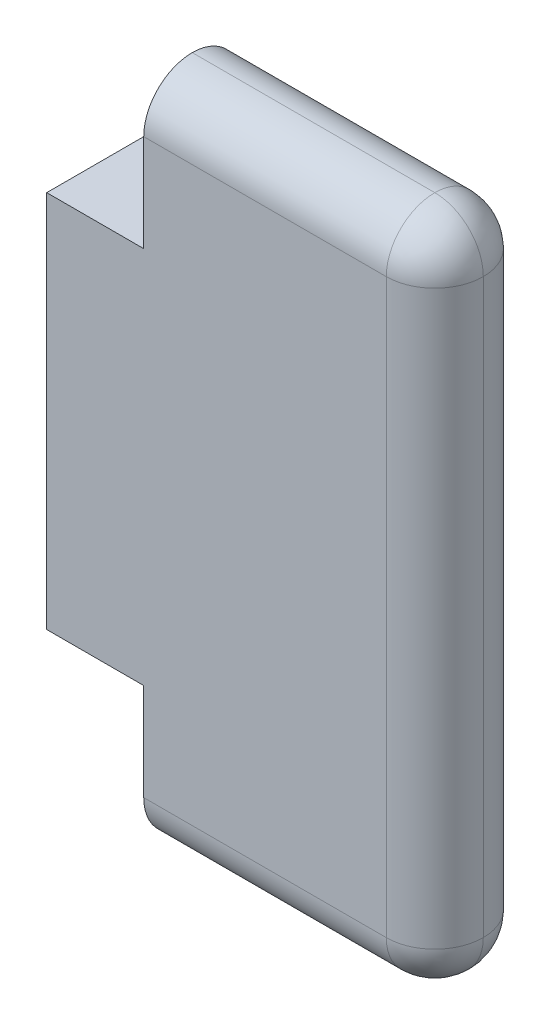
ISO-10303-21;
HEADER;
FILE_DESCRIPTION(('STEP AP214'),'2;1');
FILE_NAME('part.step','',(''),(''),'','','');
FILE_SCHEMA(('AUTOMOTIVE_DESIGN { 1 0 10303 214 1 1 1 1 }'));
ENDSEC;
DATA;
#1=APPLICATION_CONTEXT('core data for automotive mechanical design processes');
#2=APPLICATION_PROTOCOL_DEFINITION('international standard','automotive_design',2000,#1);
#3=PRODUCT_CONTEXT('',#1,'mechanical');
#4=PRODUCT('Part','Part','',(#3));
#5=PRODUCT_RELATED_PRODUCT_CATEGORY('part','',(#4));
#6=PRODUCT_DEFINITION_FORMATION('','',#4);
#7=PRODUCT_DEFINITION_CONTEXT('part definition',#1,'design');
#8=PRODUCT_DEFINITION('design','',#6,#7);
#9=PRODUCT_DEFINITION_SHAPE('','',#8);
#10=(LENGTH_UNIT() NAMED_UNIT(*) SI_UNIT(.MILLI.,.METRE.));
#11=(NAMED_UNIT(*) PLANE_ANGLE_UNIT() SI_UNIT($,.RADIAN.));
#12=(NAMED_UNIT(*) SI_UNIT($,.STERADIAN.) SOLID_ANGLE_UNIT());
#13=UNCERTAINTY_MEASURE_WITH_UNIT(LENGTH_MEASURE(1.E-05),#10,'distance_accuracy_value','');
#14=(GEOMETRIC_REPRESENTATION_CONTEXT(3) GLOBAL_UNCERTAINTY_ASSIGNED_CONTEXT((#13)) GLOBAL_UNIT_ASSIGNED_CONTEXT((#10,
#11,#12)) REPRESENTATION_CONTEXT('',''));
#15=CARTESIAN_POINT('',(0.,0.,0.));
#16=DIRECTION('',(0.,0.,1.));
#17=DIRECTION('',(1.,0.,0.));
#18=AXIS2_PLACEMENT_3D('',#15,#16,#17);
#19=CARTESIAN_POINT('',(9.99999999999998,-19.5,10.));
#20=DIRECTION('',(0.,1.,0.));
#21=DIRECTION('',(0.,0.,1.));
#22=AXIS2_PLACEMENT_3D('',#19,#20,#21);
#23=PLANE('',#22);
#24=DIRECTION('',(1.,0.,0.));
#25=VECTOR('',#24,1.);
#26=CARTESIAN_POINT('',(9.99999999999998,-19.5,0.));
#27=LINE('',#26,#25);
#28=CARTESIAN_POINT('',(0.,-19.5,0.));
#29=VERTEX_POINT('',#28);
#30=CARTESIAN_POINT('',(9.99999999999998,-19.5,0.));
#31=VERTEX_POINT('',#30);
#32=EDGE_CURVE('E139',#29,#31,#27,.T.);
#33=ORIENTED_EDGE('',*,*,#32,.T.);
#34=DIRECTION('',(0.,0.,-1.));
#35=VECTOR('',#34,1.);
#36=CARTESIAN_POINT('',(9.99999999999998,-19.5,10.));
#37=LINE('',#36,#35);
#38=CARTESIAN_POINT('',(9.99999999999998,-19.5,10.));
#39=VERTEX_POINT('',#38);
#40=EDGE_CURVE('E145',#39,#31,#37,.T.);
#41=ORIENTED_EDGE('',*,*,#40,.F.);
#42=DIRECTION('',(1.,0.,0.));
#43=VECTOR('',#42,1.);
#44=CARTESIAN_POINT('',(9.99999999999998,-19.5,10.));
#45=LINE('',#44,#43);
#46=CARTESIAN_POINT('',(0.,-19.5,10.));
#47=VERTEX_POINT('',#46);
#48=EDGE_CURVE('E161',#47,#39,#45,.T.);
#49=ORIENTED_EDGE('',*,*,#48,.F.);
#50=DIRECTION('',(0.,0.,-1.));
#51=VECTOR('',#50,1.);
#52=CARTESIAN_POINT('',(0.,-19.5,10.));
#53=LINE('',#52,#51);
#54=EDGE_CURVE('E154',#47,#29,#53,.T.);
#55=ORIENTED_EDGE('',*,*,#54,.T.);
#56=EDGE_LOOP('',(#33,#41,#49,#55));
#57=FACE_BOUND('',#56,.T.);
#58=ADVANCED_FACE('F35',(#57),#23,.F.);
#59=CARTESIAN_POINT('',(9.99999999999998,-34.5,10.));
#60=DIRECTION('',(1.,0.,0.));
#61=DIRECTION('',(0.,0.,-1.));
#62=AXIS2_PLACEMENT_3D('',#59,#60,#61);
#63=PLANE('',#62);
#64=DIRECTION('',(0.,-1.,0.));
#65=VECTOR('',#64,1.);
#66=CARTESIAN_POINT('',(9.99999999999998,-34.5,0.));
#67=LINE('',#66,#65);
#68=CARTESIAN_POINT('',(9.99999999999998,-29.5,0.));
#69=VERTEX_POINT('',#68);
#70=EDGE_CURVE('E168',#31,#69,#67,.T.);
#71=ORIENTED_EDGE('',*,*,#70,.T.);
#72=CARTESIAN_POINT('',(9.99999999999998,-29.5,5.));
#73=DIRECTION('',(1.,0.,0.));
#74=DIRECTION('',(0.,0.,-1.));
#75=AXIS2_PLACEMENT_3D('',#72,#73,#74);
#76=CIRCLE('',#75,5.);
#77=CARTESIAN_POINT('',(9.99999999999998,-34.5,5.));
#78=VERTEX_POINT('',#77);
#79=EDGE_CURVE('E11',#69,#78,#76,.F.);
#80=ORIENTED_EDGE('',*,*,#79,.T.);
#81=CARTESIAN_POINT('',(9.99999999999998,-29.5,5.));
#82=DIRECTION('',(1.,0.,0.));
#83=DIRECTION('',(0.,0.,-1.));
#84=AXIS2_PLACEMENT_3D('',#81,#82,#83);
#85=CIRCLE('',#84,5.);
#86=CARTESIAN_POINT('',(9.99999999999998,-29.5,10.));
#87=VERTEX_POINT('',#86);
#88=EDGE_CURVE('E45',#78,#87,#85,.F.);
#89=ORIENTED_EDGE('',*,*,#88,.T.);
#90=DIRECTION('',(0.,-1.,0.));
#91=VECTOR('',#90,1.);
#92=CARTESIAN_POINT('',(9.99999999999998,-34.5,10.));
#93=LINE('',#92,#91);
#94=EDGE_CURVE('E180',#39,#87,#93,.T.);
#95=ORIENTED_EDGE('',*,*,#94,.F.);
#96=ORIENTED_EDGE('',*,*,#40,.T.);
#97=EDGE_LOOP('',(#71,#80,#89,#95,#96));
#98=FACE_BOUND('',#97,.T.);
#99=ADVANCED_FACE('F199',(#98),#63,.F.);
#100=CARTESIAN_POINT('',(9.99999999999998,19.5,10.));
#101=DIRECTION('',(1.,0.,0.));
#102=DIRECTION('',(0.,1.,0.));
#103=AXIS2_PLACEMENT_3D('',#100,#101,#102);
#104=PLANE('',#103);
#105=CARTESIAN_POINT('',(9.99999999999997,29.5,5.));
#106=DIRECTION('',(1.,0.,0.));
#107=DIRECTION('',(0.,1.,0.));
#108=AXIS2_PLACEMENT_3D('',#105,#106,#107);
#109=CIRCLE('',#108,5.);
#110=CARTESIAN_POINT('',(9.99999999999997,29.5,10.));
#111=VERTEX_POINT('',#110);
#112=CARTESIAN_POINT('',(9.99999999999997,34.5,5.));
#113=VERTEX_POINT('',#112);
#114=EDGE_CURVE('E125',#111,#113,#109,.F.);
#115=ORIENTED_EDGE('',*,*,#114,.T.);
#116=CARTESIAN_POINT('',(9.99999999999997,29.5,5.));
#117=DIRECTION('',(1.,0.,0.));
#118=DIRECTION('',(0.,1.,0.));
#119=AXIS2_PLACEMENT_3D('',#116,#117,#118);
#120=CIRCLE('',#119,5.);
#121=CARTESIAN_POINT('',(9.99999999999997,29.5,0.));
#122=VERTEX_POINT('',#121);
#123=EDGE_CURVE('E122',#113,#122,#120,.F.);
#124=ORIENTED_EDGE('',*,*,#123,.T.);
#125=DIRECTION('',(0.,-1.,0.));
#126=VECTOR('',#125,1.);
#127=CARTESIAN_POINT('',(9.99999999999998,19.5,0.));
#128=LINE('',#127,#126);
#129=CARTESIAN_POINT('',(9.99999999999998,19.5,0.));
#130=VERTEX_POINT('',#129);
#131=EDGE_CURVE('E165',#122,#130,#128,.T.);
#132=ORIENTED_EDGE('',*,*,#131,.T.);
#133=DIRECTION('',(0.,0.,-1.));
#134=VECTOR('',#133,1.);
#135=CARTESIAN_POINT('',(9.99999999999998,19.5,10.));
#136=LINE('',#135,#134);
#137=CARTESIAN_POINT('',(9.99999999999998,19.5,10.));
#138=VERTEX_POINT('',#137);
#139=EDGE_CURVE('E148',#138,#130,#136,.T.);
#140=ORIENTED_EDGE('',*,*,#139,.F.);
#141=DIRECTION('',(0.,-1.,0.));
#142=VECTOR('',#141,1.);
#143=CARTESIAN_POINT('',(9.99999999999998,19.5,10.));
#144=LINE('',#143,#142);
#145=EDGE_CURVE('E177',#111,#138,#144,.T.);
#146=ORIENTED_EDGE('',*,*,#145,.F.);
#147=EDGE_LOOP('',(#115,#124,#132,#140,#146));
#148=FACE_BOUND('',#147,.T.);
#149=ADVANCED_FACE('F248',(#148),#104,.F.);
#150=CARTESIAN_POINT('',(0.,19.5,10.));
#151=DIRECTION('',(0.,-1.,0.));
#152=DIRECTION('',(0.,0.,-1.));
#153=AXIS2_PLACEMENT_3D('',#150,#151,#152);
#154=PLANE('',#153);
#155=DIRECTION('',(-1.,0.,0.));
#156=VECTOR('',#155,1.);
#157=CARTESIAN_POINT('',(0.,19.5,0.));
#158=LINE('',#157,#156);
#159=CARTESIAN_POINT('',(0.,19.5,0.));
#160=VERTEX_POINT('',#159);
#161=EDGE_CURVE('E162',#130,#160,#158,.T.);
#162=ORIENTED_EDGE('',*,*,#161,.T.);
#163=DIRECTION('',(0.,0.,-1.));
#164=VECTOR('',#163,1.);
#165=CARTESIAN_POINT('',(0.,19.5,10.));
#166=LINE('',#165,#164);
#167=CARTESIAN_POINT('',(0.,19.5,10.));
#168=VERTEX_POINT('',#167);
#169=EDGE_CURVE('E151',#168,#160,#166,.T.);
#170=ORIENTED_EDGE('',*,*,#169,.F.);
#171=DIRECTION('',(-1.,0.,0.));
#172=VECTOR('',#171,1.);
#173=CARTESIAN_POINT('',(0.,19.5,10.));
#174=LINE('',#173,#172);
#175=EDGE_CURVE('E174',#138,#168,#174,.T.);
#176=ORIENTED_EDGE('',*,*,#175,.F.);
#177=ORIENTED_EDGE('',*,*,#139,.T.);
#178=EDGE_LOOP('',(#162,#170,#176,#177));
#179=FACE_BOUND('',#178,.T.);
#180=ADVANCED_FACE('F255',(#179),#154,.F.);
#181=CARTESIAN_POINT('',(0.,-19.5,10.));
#182=DIRECTION('',(1.,0.,0.));
#183=DIRECTION('',(0.,1.,0.));
#184=AXIS2_PLACEMENT_3D('',#181,#182,#183);
#185=PLANE('',#184);
#186=DIRECTION('',(0.,-1.,0.));
#187=VECTOR('',#186,1.);
#188=CARTESIAN_POINT('',(0.,-19.5,0.));
#189=LINE('',#188,#187);
#190=EDGE_CURVE('E158',#160,#29,#189,.T.);
#191=ORIENTED_EDGE('',*,*,#190,.T.);
#192=ORIENTED_EDGE('',*,*,#54,.F.);
#193=DIRECTION('',(0.,-1.,0.));
#194=VECTOR('',#193,1.);
#195=CARTESIAN_POINT('',(0.,-19.5,10.));
#196=LINE('',#195,#194);
#197=EDGE_CURVE('E157',#168,#47,#196,.T.);
#198=ORIENTED_EDGE('',*,*,#197,.F.);
#199=ORIENTED_EDGE('',*,*,#169,.T.);
#200=EDGE_LOOP('',(#191,#192,#198,#199));
#201=FACE_BOUND('',#200,.T.);
#202=ADVANCED_FACE('F259',(#201),#185,.F.);
#203=CARTESIAN_POINT('',(0.,0.,10.));
#204=DIRECTION('',(0.,0.,-1.));
#205=DIRECTION('',(-1.,0.,0.));
#206=AXIS2_PLACEMENT_3D('',#203,#204,#205);
#207=PLANE('',#206);
#208=DIRECTION('',(0.,1.,0.));
#209=VECTOR('',#208,1.);
#210=CARTESIAN_POINT('',(35.,0.,10.));
#211=LINE('',#210,#209);
#212=CARTESIAN_POINT('',(35.,-29.5,10.));
#213=VERTEX_POINT('',#212);
#214=CARTESIAN_POINT('',(35.,29.5,10.));
#215=VERTEX_POINT('',#214);
#216=EDGE_CURVE('E142',#213,#215,#211,.T.);
#217=ORIENTED_EDGE('',*,*,#216,.T.);
#218=DIRECTION('',(-1.,0.,0.));
#219=VECTOR('',#218,1.);
#220=CARTESIAN_POINT('',(0.,29.5,10.));
#221=LINE('',#220,#219);
#222=EDGE_CURVE('E112',#215,#111,#221,.T.);
#223=ORIENTED_EDGE('',*,*,#222,.T.);
#224=ORIENTED_EDGE('',*,*,#145,.T.);
#225=ORIENTED_EDGE('',*,*,#175,.T.);
#226=ORIENTED_EDGE('',*,*,#197,.T.);
#227=ORIENTED_EDGE('',*,*,#48,.T.);
#228=ORIENTED_EDGE('',*,*,#94,.T.);
#229=DIRECTION('',(1.,0.,0.));
#230=VECTOR('',#229,1.);
#231=CARTESIAN_POINT('',(0.,-29.5,10.));
#232=LINE('',#231,#230);
#233=EDGE_CURVE('E115',#87,#213,#232,.T.);
#234=ORIENTED_EDGE('',*,*,#233,.T.);
#235=EDGE_LOOP('',(#217,#223,#224,#225,#226,#227,#228,#234));
#236=FACE_BOUND('',#235,.T.);
#237=ADVANCED_FACE('F188',(#236),#207,.F.);
#238=CARTESIAN_POINT('',(0.,0.,0.));
#239=DIRECTION('',(0.,0.,-1.));
#240=DIRECTION('',(-1.,0.,0.));
#241=AXIS2_PLACEMENT_3D('',#238,#239,#240);
#242=PLANE('',#241);
#243=ORIENTED_EDGE('',*,*,#131,.F.);
#244=DIRECTION('',(-1.,0.,0.));
#245=VECTOR('',#244,1.);
#246=CARTESIAN_POINT('',(35.,29.5,0.));
#247=LINE('',#246,#245);
#248=CARTESIAN_POINT('',(35.,29.5,0.));
#249=VERTEX_POINT('',#248);
#250=EDGE_CURVE('E118',#122,#249,#247,.F.);
#251=ORIENTED_EDGE('',*,*,#250,.T.);
#252=DIRECTION('',(0.,1.,0.));
#253=VECTOR('',#252,1.);
#254=CARTESIAN_POINT('',(35.,-34.5,0.));
#255=LINE('',#254,#253);
#256=CARTESIAN_POINT('',(35.,-29.5,0.));
#257=VERTEX_POINT('',#256);
#258=EDGE_CURVE('E136',#249,#257,#255,.F.);
#259=ORIENTED_EDGE('',*,*,#258,.T.);
#260=DIRECTION('',(1.,0.,0.));
#261=VECTOR('',#260,1.);
#262=CARTESIAN_POINT('',(9.99999999999998,-29.5,0.));
#263=LINE('',#262,#261);
#264=EDGE_CURVE('E93',#257,#69,#263,.F.);
#265=ORIENTED_EDGE('',*,*,#264,.T.);
#266=ORIENTED_EDGE('',*,*,#70,.F.);
#267=ORIENTED_EDGE('',*,*,#32,.F.);
#268=ORIENTED_EDGE('',*,*,#190,.F.);
#269=ORIENTED_EDGE('',*,*,#161,.F.);
#270=EDGE_LOOP('',(#243,#251,#259,#265,#266,#267,#268,#269));
#271=FACE_BOUND('',#270,.T.);
#272=ADVANCED_FACE('F224',(#271),#242,.T.);
#273=CARTESIAN_POINT('',(35.,0.,5.));
#274=DIRECTION('',(0.,1.,0.));
#275=DIRECTION('',(0.,0.,1.));
#276=AXIS2_PLACEMENT_3D('',#273,#274,#275);
#277=CYLINDRICAL_SURFACE('',#276,5.);
#278=DIRECTION('',(0.,1.,0.));
#279=VECTOR('',#278,1.);
#280=CARTESIAN_POINT('',(40.,34.5,5.));
#281=LINE('',#280,#279);
#282=CARTESIAN_POINT('',(40.,29.5,5.));
#283=VERTEX_POINT('',#282);
#284=CARTESIAN_POINT('',(40.,-29.5,5.));
#285=VERTEX_POINT('',#284);
#286=EDGE_CURVE('E103',#283,#285,#281,.F.);
#287=ORIENTED_EDGE('',*,*,#286,.F.);
#288=CARTESIAN_POINT('',(35.,29.5,5.));
#289=DIRECTION('',(0.,1.,0.));
#290=DIRECTION('',(0.,0.,1.));
#291=AXIS2_PLACEMENT_3D('',#288,#289,#290);
#292=CIRCLE('',#291,5.);
#293=EDGE_CURVE('E128',#283,#215,#292,.F.);
#294=ORIENTED_EDGE('',*,*,#293,.T.);
#295=ORIENTED_EDGE('',*,*,#216,.F.);
#296=CARTESIAN_POINT('',(35.,-29.5,5.));
#297=DIRECTION('',(0.,1.,0.));
#298=DIRECTION('',(0.,0.,1.));
#299=AXIS2_PLACEMENT_3D('',#296,#297,#298);
#300=CIRCLE('',#299,5.);
#301=EDGE_CURVE('E86',#213,#285,#300,.T.);
#302=ORIENTED_EDGE('',*,*,#301,.T.);
#303=EDGE_LOOP('',(#287,#294,#295,#302));
#304=FACE_BOUND('',#303,.T.);
#305=ADVANCED_FACE('F243',(#304),#277,.T.);
#306=CARTESIAN_POINT('',(35.,34.5,5.));
#307=DIRECTION('',(0.,-1.,0.));
#308=DIRECTION('',(0.,0.,-1.));
#309=AXIS2_PLACEMENT_3D('',#306,#307,#308);
#310=CYLINDRICAL_SURFACE('',#309,5.);
#311=ORIENTED_EDGE('',*,*,#258,.F.);
#312=CARTESIAN_POINT('',(35.,29.5,5.));
#313=DIRECTION('',(0.,-1.,0.));
#314=DIRECTION('',(0.,0.,-1.));
#315=AXIS2_PLACEMENT_3D('',#312,#313,#314);
#316=CIRCLE('',#315,5.);
#317=EDGE_CURVE('E132',#249,#283,#316,.T.);
#318=ORIENTED_EDGE('',*,*,#317,.T.);
#319=ORIENTED_EDGE('',*,*,#286,.T.);
#320=CARTESIAN_POINT('',(35.,-29.5,5.));
#321=DIRECTION('',(0.,-1.,0.));
#322=DIRECTION('',(0.,0.,-1.));
#323=AXIS2_PLACEMENT_3D('',#320,#321,#322);
#324=CIRCLE('',#323,5.);
#325=EDGE_CURVE('E99',#285,#257,#324,.F.);
#326=ORIENTED_EDGE('',*,*,#325,.T.);
#327=EDGE_LOOP('',(#311,#318,#319,#326));
#328=FACE_BOUND('',#327,.T.);
#329=ADVANCED_FACE('F229',(#328),#310,.T.);
#330=CARTESIAN_POINT('',(0.,29.5,5.));
#331=DIRECTION('',(-1.,0.,0.));
#332=DIRECTION('',(0.,0.,1.));
#333=AXIS2_PLACEMENT_3D('',#330,#331,#332);
#334=CYLINDRICAL_SURFACE('',#333,5.);
#335=ORIENTED_EDGE('',*,*,#114,.F.);
#336=ORIENTED_EDGE('',*,*,#222,.F.);
#337=CARTESIAN_POINT('',(35.,29.5,5.));
#338=DIRECTION('',(1.,0.,0.));
#339=DIRECTION('',(0.,0.,-1.));
#340=AXIS2_PLACEMENT_3D('',#337,#338,#339);
#341=CIRCLE('',#340,5.);
#342=CARTESIAN_POINT('',(35.,34.5,5.));
#343=VERTEX_POINT('',#342);
#344=EDGE_CURVE('E64',#343,#215,#341,.T.);
#345=ORIENTED_EDGE('',*,*,#344,.F.);
#346=DIRECTION('',(-1.,0.,0.));
#347=VECTOR('',#346,1.);
#348=CARTESIAN_POINT('',(9.99999999999997,34.5,5.));
#349=LINE('',#348,#347);
#350=EDGE_CURVE('E104',#113,#343,#349,.F.);
#351=ORIENTED_EDGE('',*,*,#350,.F.);
#352=EDGE_LOOP('',(#335,#336,#345,#351));
#353=FACE_BOUND('',#352,.T.);
#354=ADVANCED_FACE('F246',(#353),#334,.T.);
#355=CARTESIAN_POINT('',(35.,29.5,5.));
#356=DIRECTION('',(0.,0.,1.));
#357=DIRECTION('',(1.,0.,0.));
#358=AXIS2_PLACEMENT_3D('',#355,#356,#357);
#359=SPHERICAL_SURFACE('',#358,5.);
#360=ORIENTED_EDGE('',*,*,#344,.T.);
#361=ORIENTED_EDGE('',*,*,#293,.F.);
#362=CARTESIAN_POINT('',(35.,29.5,5.));
#363=DIRECTION('',(0.,0.,-1.));
#364=DIRECTION('',(-1.,0.,0.));
#365=AXIS2_PLACEMENT_3D('',#362,#363,#364);
#366=CIRCLE('',#365,5.);
#367=EDGE_CURVE('E106',#343,#283,#366,.T.);
#368=ORIENTED_EDGE('',*,*,#367,.F.);
#369=EDGE_LOOP('',(#360,#361,#368));
#370=FACE_BOUND('',#369,.T.);
#371=ADVANCED_FACE('F240',(#370),#359,.T.);
#372=CARTESIAN_POINT('',(9.99999999999997,29.5,5.));
#373=DIRECTION('',(1.,0.,0.));
#374=DIRECTION('',(0.,0.,-1.));
#375=AXIS2_PLACEMENT_3D('',#372,#373,#374);
#376=CYLINDRICAL_SURFACE('',#375,5.);
#377=ORIENTED_EDGE('',*,*,#123,.F.);
#378=ORIENTED_EDGE('',*,*,#350,.T.);
#379=CARTESIAN_POINT('',(35.,29.5,5.));
#380=DIRECTION('',(1.,0.,0.));
#381=DIRECTION('',(0.,0.,-1.));
#382=AXIS2_PLACEMENT_3D('',#379,#380,#381);
#383=CIRCLE('',#382,5.);
#384=EDGE_CURVE('E80',#249,#343,#383,.T.);
#385=ORIENTED_EDGE('',*,*,#384,.F.);
#386=ORIENTED_EDGE('',*,*,#250,.F.);
#387=EDGE_LOOP('',(#377,#378,#385,#386));
#388=FACE_BOUND('',#387,.T.);
#389=ADVANCED_FACE('F234',(#388),#376,.T.);
#390=CARTESIAN_POINT('',(35.,29.5,5.));
#391=DIRECTION('',(0.,0.,1.));
#392=DIRECTION('',(1.,0.,0.));
#393=AXIS2_PLACEMENT_3D('',#390,#391,#392);
#394=SPHERICAL_SURFACE('',#393,5.);
#395=ORIENTED_EDGE('',*,*,#384,.T.);
#396=ORIENTED_EDGE('',*,*,#367,.T.);
#397=ORIENTED_EDGE('',*,*,#317,.F.);
#398=EDGE_LOOP('',(#395,#396,#397));
#399=FACE_BOUND('',#398,.T.);
#400=ADVANCED_FACE('F237',(#399),#394,.T.);
#401=CARTESIAN_POINT('',(0.,-29.5,5.));
#402=DIRECTION('',(1.,0.,0.));
#403=DIRECTION('',(0.,1.,0.));
#404=AXIS2_PLACEMENT_3D('',#401,#402,#403);
#405=CYLINDRICAL_SURFACE('',#404,5.);
#406=ORIENTED_EDGE('',*,*,#233,.F.);
#407=ORIENTED_EDGE('',*,*,#88,.F.);
#408=DIRECTION('',(1.,0.,0.));
#409=VECTOR('',#408,1.);
#410=CARTESIAN_POINT('',(40.,-34.5,5.));
#411=LINE('',#410,#409);
#412=CARTESIAN_POINT('',(35.,-34.5,5.));
#413=VERTEX_POINT('',#412);
#414=EDGE_CURVE('E39',#413,#78,#411,.F.);
#415=ORIENTED_EDGE('',*,*,#414,.F.);
#416=CARTESIAN_POINT('',(35.,-29.5,5.));
#417=DIRECTION('',(1.,0.,0.));
#418=DIRECTION('',(0.,1.,0.));
#419=AXIS2_PLACEMENT_3D('',#416,#417,#418);
#420=CIRCLE('',#419,5.);
#421=EDGE_CURVE('E76',#213,#413,#420,.T.);
#422=ORIENTED_EDGE('',*,*,#421,.F.);
#423=EDGE_LOOP('',(#406,#407,#415,#422));
#424=FACE_BOUND('',#423,.T.);
#425=ADVANCED_FACE('F37',(#424),#405,.T.);
#426=CARTESIAN_POINT('',(40.,-29.5,5.));
#427=DIRECTION('',(-1.,0.,0.));
#428=DIRECTION('',(0.,-1.,0.));
#429=AXIS2_PLACEMENT_3D('',#426,#427,#428);
#430=CYLINDRICAL_SURFACE('',#429,5.);
#431=ORIENTED_EDGE('',*,*,#79,.F.);
#432=ORIENTED_EDGE('',*,*,#264,.F.);
#433=CARTESIAN_POINT('',(35.,-29.5,5.));
#434=DIRECTION('',(1.,0.,0.));
#435=DIRECTION('',(0.,1.,0.));
#436=AXIS2_PLACEMENT_3D('',#433,#434,#435);
#437=CIRCLE('',#436,5.);
#438=EDGE_CURVE('E87',#413,#257,#437,.T.);
#439=ORIENTED_EDGE('',*,*,#438,.F.);
#440=ORIENTED_EDGE('',*,*,#414,.T.);
#441=EDGE_LOOP('',(#431,#432,#439,#440));
#442=FACE_BOUND('',#441,.T.);
#443=ADVANCED_FACE('F90',(#442),#430,.T.);
#444=CARTESIAN_POINT('',(35.,-29.5,5.));
#445=DIRECTION('',(0.,0.,1.));
#446=DIRECTION('',(1.,0.,0.));
#447=AXIS2_PLACEMENT_3D('',#444,#445,#446);
#448=SPHERICAL_SURFACE('',#447,5.);
#449=ORIENTED_EDGE('',*,*,#301,.F.);
#450=ORIENTED_EDGE('',*,*,#421,.T.);
#451=CARTESIAN_POINT('',(35.,-29.5,5.));
#452=DIRECTION('',(0.,0.,-1.));
#453=DIRECTION('',(-1.,0.,0.));
#454=AXIS2_PLACEMENT_3D('',#451,#452,#453);
#455=CIRCLE('',#454,5.);
#456=EDGE_CURVE('E85',#285,#413,#455,.T.);
#457=ORIENTED_EDGE('',*,*,#456,.F.);
#458=EDGE_LOOP('',(#449,#450,#457));
#459=FACE_BOUND('',#458,.T.);
#460=ADVANCED_FACE('F83',(#459),#448,.T.);
#461=CARTESIAN_POINT('',(35.,-29.5,5.));
#462=DIRECTION('',(0.,0.,1.));
#463=DIRECTION('',(1.,0.,0.));
#464=AXIS2_PLACEMENT_3D('',#461,#462,#463);
#465=SPHERICAL_SURFACE('',#464,5.);
#466=ORIENTED_EDGE('',*,*,#438,.T.);
#467=ORIENTED_EDGE('',*,*,#325,.F.);
#468=ORIENTED_EDGE('',*,*,#456,.T.);
#469=EDGE_LOOP('',(#466,#467,#468));
#470=FACE_BOUND('',#469,.T.);
#471=ADVANCED_FACE('F98',(#470),#465,.T.);
#472=CLOSED_SHELL('',(#58,#99,#149,#180,#202,#237,#272,#305,#329,#354,#371,#389,#400,#425,#443,
#460,#471));
#473=MANIFOLD_SOLID_BREP('B2',#472);
#474=ADVANCED_BREP_SHAPE_REPRESENTATION('',(#18,#473),#14);
#475=SHAPE_DEFINITION_REPRESENTATION(#9,#474);
ENDSEC;
END-ISO-10303-21;
